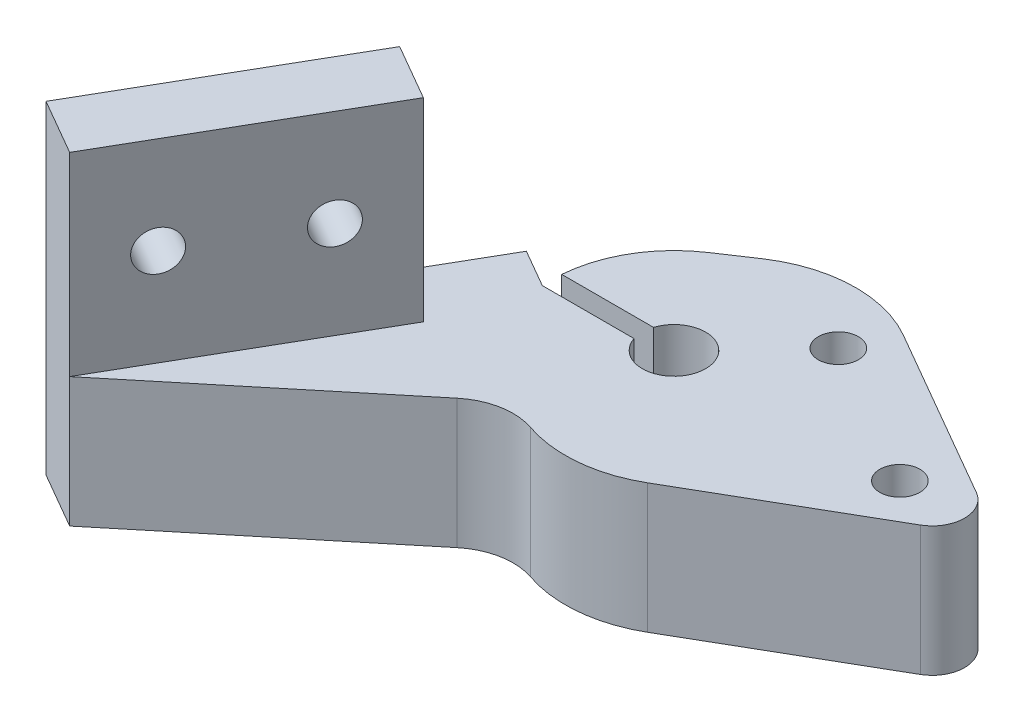
ISO-10303-21;
HEADER;
FILE_DESCRIPTION(('STEP AP214'),'2;1');
FILE_NAME('part.step','',(''),(''),'','','');
FILE_SCHEMA(('AUTOMOTIVE_DESIGN { 1 0 10303 214 1 1 1 1 }'));
ENDSEC;
DATA;
#1=APPLICATION_CONTEXT('core data for automotive mechanical design processes');
#2=APPLICATION_PROTOCOL_DEFINITION('international standard','automotive_design',2000,#1);
#3=PRODUCT_CONTEXT('',#1,'mechanical');
#4=PRODUCT('Part','Part','',(#3));
#5=PRODUCT_RELATED_PRODUCT_CATEGORY('part','',(#4));
#6=PRODUCT_DEFINITION_FORMATION('','',#4);
#7=PRODUCT_DEFINITION_CONTEXT('part definition',#1,'design');
#8=PRODUCT_DEFINITION('design','',#6,#7);
#9=PRODUCT_DEFINITION_SHAPE('','',#8);
#10=(LENGTH_UNIT() NAMED_UNIT(*) SI_UNIT(.MILLI.,.METRE.));
#11=(NAMED_UNIT(*) PLANE_ANGLE_UNIT() SI_UNIT($,.RADIAN.));
#12=(NAMED_UNIT(*) SI_UNIT($,.STERADIAN.) SOLID_ANGLE_UNIT());
#13=UNCERTAINTY_MEASURE_WITH_UNIT(LENGTH_MEASURE(1.E-05),#10,'distance_accuracy_value','');
#14=(GEOMETRIC_REPRESENTATION_CONTEXT(3) GLOBAL_UNCERTAINTY_ASSIGNED_CONTEXT((#13)) GLOBAL_UNIT_ASSIGNED_CONTEXT((#10,
#11,#12)) REPRESENTATION_CONTEXT('',''));
#15=CARTESIAN_POINT('',(0.,0.,0.));
#16=DIRECTION('',(0.,0.,1.));
#17=DIRECTION('',(1.,0.,0.));
#18=AXIS2_PLACEMENT_3D('',#15,#16,#17);
#19=CARTESIAN_POINT('',(-9.95,10.,0.));
#20=DIRECTION('',(0.,-1.,0.));
#21=DIRECTION('',(0.,0.,-1.));
#22=AXIS2_PLACEMENT_3D('',#19,#20,#21);
#23=CYLINDRICAL_SURFACE('',#22,9.45);
#24=CARTESIAN_POINT('',(-9.95,0.,0.));
#25=DIRECTION('',(0.,1.,0.));
#26=DIRECTION('',(0.,0.,1.));
#27=AXIS2_PLACEMENT_3D('',#24,#25,#26);
#28=CIRCLE('',#27,9.45);
#29=CARTESIAN_POINT('',(-15.1916063033956,0.,-7.86308230658969));
#30=VERTEX_POINT('',#29);
#31=CARTESIAN_POINT('',(-19.3701910808646,0.,-0.749999999999998));
#32=VERTEX_POINT('',#31);
#33=EDGE_CURVE('E285',#30,#32,#28,.T.);
#34=ORIENTED_EDGE('',*,*,#33,.T.);
#35=DIRECTION('',(0.,-1.,0.));
#36=VECTOR('',#35,1.);
#37=CARTESIAN_POINT('',(-19.3701910808646,10.,-0.749999999999998));
#38=LINE('',#37,#36);
#39=CARTESIAN_POINT('',(-19.3701910808646,10.,-0.749999999999998));
#40=VERTEX_POINT('',#39);
#41=EDGE_CURVE('E330',#32,#40,#38,.F.);
#42=ORIENTED_EDGE('',*,*,#41,.T.);
#43=CARTESIAN_POINT('',(-9.95,10.,0.));
#44=DIRECTION('',(0.,1.,0.));
#45=DIRECTION('',(0.,0.,1.));
#46=AXIS2_PLACEMENT_3D('',#43,#44,#45);
#47=CIRCLE('',#46,9.45);
#48=CARTESIAN_POINT('',(-15.1916063033956,10.,-7.86308230658969));
#49=VERTEX_POINT('',#48);
#50=EDGE_CURVE('E284',#49,#40,#47,.T.);
#51=ORIENTED_EDGE('',*,*,#50,.F.);
#52=DIRECTION('',(0.,-1.,0.));
#53=VECTOR('',#52,1.);
#54=CARTESIAN_POINT('',(-15.1916063033956,10.,-7.86308230658969));
#55=LINE('',#54,#53);
#56=EDGE_CURVE('E281',#49,#30,#55,.T.);
#57=ORIENTED_EDGE('',*,*,#56,.T.);
#58=EDGE_LOOP('',(#34,#42,#51,#57));
#59=FACE_BOUND('',#58,.T.);
#60=ADVANCED_FACE('F35',(#59),#23,.T.);
#61=CARTESIAN_POINT('',(-7.12122377100341,10.,1.22468911520026));
#62=DIRECTION('',(0.,1.,0.));
#63=DIRECTION('',(0.,0.,1.));
#64=AXIS2_PLACEMENT_3D('',#61,#62,#63);
#65=PLANE('',#64);
#66=DIRECTION('',(-0.866025403784438,0.,-0.500000000000001));
#67=VECTOR('',#66,1.);
#68=CARTESIAN_POINT('',(-25.8686831430116,10.,5.27196790422171));
#69=LINE('',#68,#67);
#70=CARTESIAN_POINT('',(-21.5385561240894,10.,7.77196790422172));
#71=VERTEX_POINT('',#70);
#72=CARTESIAN_POINT('',(-25.8686831430116,10.,5.27196790422171));
#73=VERTEX_POINT('',#72);
#74=EDGE_CURVE('E176',#71,#73,#69,.T.);
#75=ORIENTED_EDGE('',*,*,#74,.F.);
#76=DIRECTION('',(0.500000000000001,0.,-0.866025403784438));
#77=VECTOR('',#76,1.);
#78=CARTESIAN_POINT('',(-31.5385561240894,10.,25.0924759799105));
#79=LINE('',#78,#77);
#80=CARTESIAN_POINT('',(-31.5385561240894,10.,25.0924759799105));
#81=VERTEX_POINT('',#80);
#82=EDGE_CURVE('E214',#81,#71,#79,.T.);
#83=ORIENTED_EDGE('',*,*,#82,.F.);
#84=DIRECTION('',(0.771799318585592,0.,-0.635866190193201));
#85=VECTOR('',#84,1.);
#86=CARTESIAN_POINT('',(-0.437441388363334,10.,-0.530955994621095));
#87=LINE('',#86,#85);
#88=CARTESIAN_POINT('',(-15.1240706779427,10.,11.5689912173808));
#89=VERTEX_POINT('',#88);
#90=EDGE_CURVE('E200',#81,#89,#87,.T.);
#91=ORIENTED_EDGE('',*,*,#90,.T.);
#92=CARTESIAN_POINT('',(-11.9447397269767,10.,15.4279878103088));
#93=DIRECTION('',(0.,1.,0.));
#94=DIRECTION('',(0.,0.,1.));
#95=AXIS2_PLACEMENT_3D('',#92,#93,#94);
#96=CIRCLE('',#95,5.);
#97=CARTESIAN_POINT('',(-10.3369010749856,10.,10.6935549119393));
#98=VERTEX_POINT('',#97);
#99=EDGE_CURVE('E11',#89,#98,#96,.F.);
#100=ORIENTED_EDGE('',*,*,#99,.T.);
#101=CARTESIAN_POINT('',(-7.12122377100341,10.,1.22468911520026));
#102=DIRECTION('',(0.,1.,0.));
#103=DIRECTION('',(0.,0.,1.));
#104=AXIS2_PLACEMENT_3D('',#101,#102,#103);
#105=CIRCLE('',#104,10.);
#106=CARTESIAN_POINT('',(-2.12122377100337,10.,9.88494315304462));
#107=VERTEX_POINT('',#106);
#108=EDGE_CURVE('E288',#98,#107,#105,.T.);
#109=ORIENTED_EDGE('',*,*,#108,.T.);
#110=DIRECTION('',(0.866025403784439,0.,-0.5));
#111=VECTOR('',#110,1.);
#112=CARTESIAN_POINT('',(-2.12122377100337,10.,9.88494315304462));
#113=LINE('',#112,#111);
#114=CARTESIAN_POINT('',(11.25,10.,2.16506350946111));
#115=VERTEX_POINT('',#114);
#116=EDGE_CURVE('E312',#107,#115,#113,.T.);
#117=ORIENTED_EDGE('',*,*,#116,.T.);
#118=CARTESIAN_POINT('',(10.,10.,0.));
#119=DIRECTION('',(0.,1.,0.));
#120=DIRECTION('',(0.,0.,-1.));
#121=AXIS2_PLACEMENT_3D('',#118,#119,#120);
#122=CIRCLE('',#121,2.5);
#123=CARTESIAN_POINT('',(11.25,10.,-2.16506350946111));
#124=VERTEX_POINT('',#123);
#125=EDGE_CURVE('E310',#115,#124,#122,.T.);
#126=ORIENTED_EDGE('',*,*,#125,.T.);
#127=DIRECTION('',(-0.866025403784439,0.,-0.5));
#128=VECTOR('',#127,1.);
#129=CARTESIAN_POINT('',(11.25,10.,-2.16506350946111));
#130=LINE('',#129,#128);
#131=CARTESIAN_POINT('',(-2.12122377100337,10.,-9.88494315304462));
#132=VERTEX_POINT('',#131);
#133=EDGE_CURVE('E308',#124,#132,#130,.T.);
#134=ORIENTED_EDGE('',*,*,#133,.T.);
#135=CARTESIAN_POINT('',(-7.12122377100341,10.,-1.22468911520026));
#136=DIRECTION('',(0.,1.,0.));
#137=DIRECTION('',(0.,0.,1.));
#138=AXIS2_PLACEMENT_3D('',#135,#136,#137);
#139=CIRCLE('',#138,10.);
#140=CARTESIAN_POINT('',(-12.66789710793,10.,-9.54541113275546));
#141=VERTEX_POINT('',#140);
#142=EDGE_CURVE('E306',#132,#141,#139,.T.);
#143=ORIENTED_EDGE('',*,*,#142,.T.);
#144=DIRECTION('',(-0.832072201755523,0.,0.554667333692653));
#145=VECTOR('',#144,1.);
#146=CARTESIAN_POINT('',(-12.66789710793,10.,-9.54541113275546));
#147=LINE('',#146,#145);
#148=EDGE_CURVE('E304',#141,#49,#147,.T.);
#149=ORIENTED_EDGE('',*,*,#148,.T.);
#150=ORIENTED_EDGE('',*,*,#50,.T.);
#151=DIRECTION('',(-1.,0.,0.));
#152=VECTOR('',#151,1.);
#153=CARTESIAN_POINT('',(-9.95,10.,-0.750000000000002));
#154=LINE('',#153,#152);
#155=CARTESIAN_POINT('',(-12.2823807579381,10.,-0.750000000000001));
#156=VERTEX_POINT('',#155);
#157=EDGE_CURVE('E202',#156,#40,#154,.T.);
#158=ORIENTED_EDGE('',*,*,#157,.F.);
#159=CARTESIAN_POINT('',(-9.95,10.,0.));
#160=DIRECTION('',(0.,1.,0.));
#161=DIRECTION('',(0.,0.,1.));
#162=AXIS2_PLACEMENT_3D('',#159,#160,#161);
#163=CIRCLE('',#162,2.45);
#164=CARTESIAN_POINT('',(-12.2823807579381,10.,0.749999999999998));
#165=VERTEX_POINT('',#164);
#166=EDGE_CURVE('E324',#165,#156,#163,.T.);
#167=ORIENTED_EDGE('',*,*,#166,.F.);
#168=DIRECTION('',(1.,0.,0.));
#169=VECTOR('',#168,1.);
#170=CARTESIAN_POINT('',(-9.95,10.,0.749999999999998));
#171=LINE('',#170,#169);
#172=CARTESIAN_POINT('',(-19.3701910808646,10.,0.75));
#173=VERTEX_POINT('',#172);
#174=EDGE_CURVE('E339',#173,#165,#171,.T.);
#175=ORIENTED_EDGE('',*,*,#174,.F.);
#176=DIRECTION('',(-0.866025403784439,0.,-0.5));
#177=VECTOR('',#176,1.);
#178=CARTESIAN_POINT('',(-5.1673072966353,10.,8.95003877609373));
#179=LINE('',#178,#177);
#180=CARTESIAN_POINT('',(-22.2859905873979,10.,-0.933437629999999));
#181=VERTEX_POINT('',#180);
#182=EDGE_CURVE('E198',#173,#181,#179,.T.);
#183=ORIENTED_EDGE('',*,*,#182,.T.);
#184=DIRECTION('',(-0.500000000000001,0.,0.866025403784438));
#185=VECTOR('',#184,1.);
#186=CARTESIAN_POINT('',(-17.1186832907626,10.,-9.88347640609373));
#187=LINE('',#186,#185);
#188=EDGE_CURVE('E203',#181,#73,#187,.T.);
#189=ORIENTED_EDGE('',*,*,#188,.T.);
#190=EDGE_LOOP('',(#75,#83,#91,#100,#109,#117,#126,#134,#143,#149,#150,#158,#167,#175,#183,#189));
#191=FACE_BOUND('',#190,.T.);
#192=CARTESIAN_POINT('',(-3.75,10.,-6.49519052838329));
#193=DIRECTION('',(0.,1.,0.));
#194=DIRECTION('',(0.,0.,1.));
#195=AXIS2_PLACEMENT_3D('',#192,#193,#194);
#196=CIRCLE('',#195,1.55);
#197=CARTESIAN_POINT('',(-3.75,10.,-4.94519052838329));
#198=VERTEX_POINT('',#197);
#199=EDGE_CURVE('E318',#198,#198,#196,.T.);
#200=ORIENTED_EDGE('',*,*,#199,.F.);
#201=EDGE_LOOP('',(#200));
#202=FACE_BOUND('',#201,.T.);
#203=CARTESIAN_POINT('',(7.5,10.,0.));
#204=DIRECTION('',(0.,1.,0.));
#205=DIRECTION('',(0.,0.,1.));
#206=AXIS2_PLACEMENT_3D('',#203,#204,#205);
#207=CIRCLE('',#206,1.55);
#208=CARTESIAN_POINT('',(7.5,10.,1.55));
#209=VERTEX_POINT('',#208);
#210=EDGE_CURVE('E301',#209,#209,#207,.T.);
#211=ORIENTED_EDGE('',*,*,#210,.F.);
#212=EDGE_LOOP('',(#211));
#213=FACE_BOUND('',#212,.T.);
#214=ADVANCED_FACE('F364',(#191,#202,#213),#65,.T.);
#215=CARTESIAN_POINT('',(-7.12122377100341,0.,1.22468911520026));
#216=DIRECTION('',(0.,1.,0.));
#217=DIRECTION('',(0.,0.,1.));
#218=AXIS2_PLACEMENT_3D('',#215,#216,#217);
#219=PLANE('',#218);
#220=CARTESIAN_POINT('',(-3.75,0.,-6.49519052838329));
#221=DIRECTION('',(0.,1.,0.));
#222=DIRECTION('',(0.,0.,1.));
#223=AXIS2_PLACEMENT_3D('',#220,#221,#222);
#224=CIRCLE('',#223,1.55);
#225=CARTESIAN_POINT('',(-3.75,0.,-4.94519052838329));
#226=VERTEX_POINT('',#225);
#227=EDGE_CURVE('E321',#226,#226,#224,.T.);
#228=ORIENTED_EDGE('',*,*,#227,.T.);
#229=EDGE_LOOP('',(#228));
#230=FACE_BOUND('',#229,.T.);
#231=CARTESIAN_POINT('',(-9.95,0.,0.));
#232=DIRECTION('',(0.,1.,0.));
#233=DIRECTION('',(0.,0.,1.));
#234=AXIS2_PLACEMENT_3D('',#231,#232,#233);
#235=CIRCLE('',#234,2.45);
#236=CARTESIAN_POINT('',(-12.2823807579381,0.,0.749999999999999));
#237=VERTEX_POINT('',#236);
#238=CARTESIAN_POINT('',(-12.2823807579381,0.,-0.750000000000001));
#239=VERTEX_POINT('',#238);
#240=EDGE_CURVE('E327',#237,#239,#235,.T.);
#241=ORIENTED_EDGE('',*,*,#240,.T.);
#242=DIRECTION('',(-1.,0.,0.));
#243=VECTOR('',#242,1.);
#244=CARTESIAN_POINT('',(-9.95,0.,-0.750000000000002));
#245=LINE('',#244,#243);
#246=EDGE_CURVE('E341',#239,#32,#245,.T.);
#247=ORIENTED_EDGE('',*,*,#246,.T.);
#248=ORIENTED_EDGE('',*,*,#33,.F.);
#249=DIRECTION('',(-0.832072201755523,0.,0.554667333692653));
#250=VECTOR('',#249,1.);
#251=CARTESIAN_POINT('',(-12.66789710793,0.,-9.54541113275546));
#252=LINE('',#251,#250);
#253=CARTESIAN_POINT('',(-12.66789710793,0.,-9.54541113275546));
#254=VERTEX_POINT('',#253);
#255=EDGE_CURVE('E289',#254,#30,#252,.T.);
#256=ORIENTED_EDGE('',*,*,#255,.F.);
#257=CARTESIAN_POINT('',(-7.12122377100341,0.,-1.22468911520026));
#258=DIRECTION('',(0.,1.,0.));
#259=DIRECTION('',(0.,0.,1.));
#260=AXIS2_PLACEMENT_3D('',#257,#258,#259);
#261=CIRCLE('',#260,10.);
#262=CARTESIAN_POINT('',(-2.12122377100337,0.,-9.88494315304462));
#263=VERTEX_POINT('',#262);
#264=EDGE_CURVE('E291',#263,#254,#261,.T.);
#265=ORIENTED_EDGE('',*,*,#264,.F.);
#266=DIRECTION('',(-0.866025403784439,0.,-0.5));
#267=VECTOR('',#266,1.);
#268=CARTESIAN_POINT('',(11.25,0.,-2.16506350946111));
#269=LINE('',#268,#267);
#270=CARTESIAN_POINT('',(11.25,0.,-2.16506350946111));
#271=VERTEX_POINT('',#270);
#272=EDGE_CURVE('E293',#271,#263,#269,.T.);
#273=ORIENTED_EDGE('',*,*,#272,.F.);
#274=CARTESIAN_POINT('',(10.,0.,0.));
#275=DIRECTION('',(0.,1.,0.));
#276=DIRECTION('',(0.,0.,-1.));
#277=AXIS2_PLACEMENT_3D('',#274,#275,#276);
#278=CIRCLE('',#277,2.5);
#279=CARTESIAN_POINT('',(11.25,0.,2.16506350946111));
#280=VERTEX_POINT('',#279);
#281=EDGE_CURVE('E295',#280,#271,#278,.T.);
#282=ORIENTED_EDGE('',*,*,#281,.F.);
#283=DIRECTION('',(0.866025403784439,0.,-0.5));
#284=VECTOR('',#283,1.);
#285=CARTESIAN_POINT('',(-2.12122377100337,0.,9.88494315304462));
#286=LINE('',#285,#284);
#287=CARTESIAN_POINT('',(-2.12122377100337,0.,9.88494315304462));
#288=VERTEX_POINT('',#287);
#289=EDGE_CURVE('E297',#288,#280,#286,.T.);
#290=ORIENTED_EDGE('',*,*,#289,.F.);
#291=CARTESIAN_POINT('',(-7.12122377100341,0.,1.22468911520026));
#292=DIRECTION('',(0.,1.,0.));
#293=DIRECTION('',(0.,0.,1.));
#294=AXIS2_PLACEMENT_3D('',#291,#292,#293);
#295=CIRCLE('',#294,10.);
#296=CARTESIAN_POINT('',(-10.3369010749856,0.,10.6935549119393));
#297=VERTEX_POINT('',#296);
#298=EDGE_CURVE('E299',#297,#288,#295,.T.);
#299=ORIENTED_EDGE('',*,*,#298,.F.);
#300=CARTESIAN_POINT('',(-11.9447397269767,0.,15.4279878103088));
#301=DIRECTION('',(0.,1.,0.));
#302=DIRECTION('',(0.,0.,1.));
#303=AXIS2_PLACEMENT_3D('',#300,#301,#302);
#304=CIRCLE('',#303,5.);
#305=CARTESIAN_POINT('',(-15.1240706779427,0.,11.5689912173808));
#306=VERTEX_POINT('',#305);
#307=EDGE_CURVE('E43',#297,#306,#304,.T.);
#308=ORIENTED_EDGE('',*,*,#307,.T.);
#309=DIRECTION('',(0.771799318585592,0.,-0.635866190193201));
#310=VECTOR('',#309,1.);
#311=CARTESIAN_POINT('',(-0.437441388363334,0.,-0.530955994621095));
#312=LINE('',#311,#310);
#313=CARTESIAN_POINT('',(-31.5385561240894,0.,25.0924759799105));
#314=VERTEX_POINT('',#313);
#315=EDGE_CURVE('E197',#314,#306,#312,.T.);
#316=ORIENTED_EDGE('',*,*,#315,.F.);
#317=DIRECTION('',(0.866025403784439,0.,0.5));
#318=VECTOR('',#317,1.);
#319=CARTESIAN_POINT('',(-18.749999852249,0.,32.4759523860042));
#320=LINE('',#319,#318);
#321=CARTESIAN_POINT('',(-35.8686831430116,0.,22.5924759799105));
#322=VERTEX_POINT('',#321);
#323=EDGE_CURVE('E195',#322,#314,#320,.T.);
#324=ORIENTED_EDGE('',*,*,#323,.F.);
#325=DIRECTION('',(-0.500000000000001,0.,0.866025403784438));
#326=VECTOR('',#325,1.);
#327=CARTESIAN_POINT('',(-17.1186832907626,0.,-9.88347640609373));
#328=LINE('',#327,#326);
#329=CARTESIAN_POINT('',(-22.2859905873979,0.,-0.933437629999999));
#330=VERTEX_POINT('',#329);
#331=EDGE_CURVE('E191',#330,#322,#328,.T.);
#332=ORIENTED_EDGE('',*,*,#331,.F.);
#333=DIRECTION('',(-0.866025403784439,0.,-0.5));
#334=VECTOR('',#333,1.);
#335=CARTESIAN_POINT('',(-5.1673072966353,0.,8.95003877609373));
#336=LINE('',#335,#334);
#337=CARTESIAN_POINT('',(-19.3701910808646,0.,0.75));
#338=VERTEX_POINT('',#337);
#339=EDGE_CURVE('E182',#338,#330,#336,.T.);
#340=ORIENTED_EDGE('',*,*,#339,.F.);
#341=DIRECTION('',(1.,0.,0.));
#342=VECTOR('',#341,1.);
#343=CARTESIAN_POINT('',(-9.95,0.,0.749999999999998));
#344=LINE('',#343,#342);
#345=EDGE_CURVE('E338',#338,#237,#344,.T.);
#346=ORIENTED_EDGE('',*,*,#345,.T.);
#347=EDGE_LOOP('',(#241,#247,#248,#256,#265,#273,#282,#290,#299,#308,#316,#324,#332,#340,#346));
#348=FACE_BOUND('',#347,.T.);
#349=CARTESIAN_POINT('',(7.5,0.,0.));
#350=DIRECTION('',(0.,1.,0.));
#351=DIRECTION('',(0.,0.,1.));
#352=AXIS2_PLACEMENT_3D('',#349,#350,#351);
#353=CIRCLE('',#352,1.55);
#354=CARTESIAN_POINT('',(7.5,0.,1.55));
#355=VERTEX_POINT('',#354);
#356=EDGE_CURVE('E315',#355,#355,#353,.T.);
#357=ORIENTED_EDGE('',*,*,#356,.T.);
#358=EDGE_LOOP('',(#357));
#359=FACE_BOUND('',#358,.T.);
#360=ADVANCED_FACE('F357',(#230,#348,#359),#219,.F.);
#361=CARTESIAN_POINT('',(-7.12122377100341,10.,1.22468911520026));
#362=DIRECTION('',(0.,-1.,0.));
#363=DIRECTION('',(0.,0.,-1.));
#364=AXIS2_PLACEMENT_3D('',#361,#362,#363);
#365=CYLINDRICAL_SURFACE('',#364,10.);
#366=ORIENTED_EDGE('',*,*,#108,.F.);
#367=DIRECTION('',(0.,-1.,0.));
#368=VECTOR('',#367,1.);
#369=CARTESIAN_POINT('',(-10.3369010749856,10.,10.6935549119393));
#370=LINE('',#369,#368);
#371=EDGE_CURVE('E252',#98,#297,#370,.T.);
#372=ORIENTED_EDGE('',*,*,#371,.T.);
#373=ORIENTED_EDGE('',*,*,#298,.T.);
#374=DIRECTION('',(0.,-1.,0.));
#375=VECTOR('',#374,1.);
#376=CARTESIAN_POINT('',(-2.12122377100337,10.,9.88494315304462));
#377=LINE('',#376,#375);
#378=EDGE_CURVE('E262',#107,#288,#377,.T.);
#379=ORIENTED_EDGE('',*,*,#378,.F.);
#380=EDGE_LOOP('',(#366,#372,#373,#379));
#381=FACE_BOUND('',#380,.T.);
#382=ADVANCED_FACE('F398',(#381),#365,.T.);
#383=CARTESIAN_POINT('',(-2.12122377100337,10.,9.88494315304462));
#384=DIRECTION('',(-0.5,0.,-0.866025403784439));
#385=DIRECTION('',(-0.866025403784439,0.,0.5));
#386=AXIS2_PLACEMENT_3D('',#383,#384,#385);
#387=PLANE('',#386);
#388=ORIENTED_EDGE('',*,*,#289,.T.);
#389=DIRECTION('',(0.,-1.,0.));
#390=VECTOR('',#389,1.);
#391=CARTESIAN_POINT('',(11.25,10.,2.16506350946111));
#392=LINE('',#391,#390);
#393=EDGE_CURVE('E267',#115,#280,#392,.T.);
#394=ORIENTED_EDGE('',*,*,#393,.F.);
#395=ORIENTED_EDGE('',*,*,#116,.F.);
#396=ORIENTED_EDGE('',*,*,#378,.T.);
#397=EDGE_LOOP('',(#388,#394,#395,#396));
#398=FACE_BOUND('',#397,.T.);
#399=ADVANCED_FACE('F397',(#398),#387,.F.);
#400=CARTESIAN_POINT('',(10.,10.,0.));
#401=DIRECTION('',(0.,-1.,0.));
#402=DIRECTION('',(0.,0.,-1.));
#403=AXIS2_PLACEMENT_3D('',#400,#401,#402);
#404=CYLINDRICAL_SURFACE('',#403,2.5);
#405=ORIENTED_EDGE('',*,*,#281,.T.);
#406=DIRECTION('',(0.,-1.,0.));
#407=VECTOR('',#406,1.);
#408=CARTESIAN_POINT('',(11.25,10.,-2.16506350946111));
#409=LINE('',#408,#407);
#410=EDGE_CURVE('E272',#124,#271,#409,.T.);
#411=ORIENTED_EDGE('',*,*,#410,.F.);
#412=ORIENTED_EDGE('',*,*,#125,.F.);
#413=ORIENTED_EDGE('',*,*,#393,.T.);
#414=EDGE_LOOP('',(#405,#411,#412,#413));
#415=FACE_BOUND('',#414,.T.);
#416=ADVANCED_FACE('F391',(#415),#404,.T.);
#417=CARTESIAN_POINT('',(11.25,10.,-2.16506350946111));
#418=DIRECTION('',(-0.5,0.,0.866025403784439));
#419=DIRECTION('',(0.866025403784439,0.,0.5));
#420=AXIS2_PLACEMENT_3D('',#417,#418,#419);
#421=PLANE('',#420);
#422=ORIENTED_EDGE('',*,*,#272,.T.);
#423=DIRECTION('',(0.,-1.,0.));
#424=VECTOR('',#423,1.);
#425=CARTESIAN_POINT('',(-2.12122377100337,10.,-9.88494315304462));
#426=LINE('',#425,#424);
#427=EDGE_CURVE('E275',#132,#263,#426,.T.);
#428=ORIENTED_EDGE('',*,*,#427,.F.);
#429=ORIENTED_EDGE('',*,*,#133,.F.);
#430=ORIENTED_EDGE('',*,*,#410,.T.);
#431=EDGE_LOOP('',(#422,#428,#429,#430));
#432=FACE_BOUND('',#431,.T.);
#433=ADVANCED_FACE('F387',(#432),#421,.F.);
#434=CARTESIAN_POINT('',(-7.12122377100341,10.,-1.22468911520026));
#435=DIRECTION('',(0.,-1.,0.));
#436=DIRECTION('',(0.,0.,-1.));
#437=AXIS2_PLACEMENT_3D('',#434,#435,#436);
#438=CYLINDRICAL_SURFACE('',#437,10.);
#439=ORIENTED_EDGE('',*,*,#264,.T.);
#440=DIRECTION('',(0.,-1.,0.));
#441=VECTOR('',#440,1.);
#442=CARTESIAN_POINT('',(-12.66789710793,10.,-9.54541113275546));
#443=LINE('',#442,#441);
#444=EDGE_CURVE('E278',#141,#254,#443,.T.);
#445=ORIENTED_EDGE('',*,*,#444,.F.);
#446=ORIENTED_EDGE('',*,*,#142,.F.);
#447=ORIENTED_EDGE('',*,*,#427,.T.);
#448=EDGE_LOOP('',(#439,#445,#446,#447));
#449=FACE_BOUND('',#448,.T.);
#450=ADVANCED_FACE('F382',(#449),#438,.T.);
#451=CARTESIAN_POINT('',(-12.66789710793,10.,-9.54541113275546));
#452=DIRECTION('',(0.554667333692653,0.,0.832072201755523));
#453=DIRECTION('',(0.832072201755523,0.,-0.554667333692653));
#454=AXIS2_PLACEMENT_3D('',#451,#452,#453);
#455=PLANE('',#454);
#456=ORIENTED_EDGE('',*,*,#255,.T.);
#457=ORIENTED_EDGE('',*,*,#56,.F.);
#458=ORIENTED_EDGE('',*,*,#148,.F.);
#459=ORIENTED_EDGE('',*,*,#444,.T.);
#460=EDGE_LOOP('',(#456,#457,#458,#459));
#461=FACE_BOUND('',#460,.T.);
#462=ADVANCED_FACE('F376',(#461),#455,.F.);
#463=CARTESIAN_POINT('',(7.5,10.,0.));
#464=DIRECTION('',(0.,-1.,0.));
#465=DIRECTION('',(0.,0.,-1.));
#466=AXIS2_PLACEMENT_3D('',#463,#464,#465);
#467=CYLINDRICAL_SURFACE('',#466,1.55);
#468=ORIENTED_EDGE('',*,*,#210,.T.);
#469=EDGE_LOOP('',(#468));
#470=FACE_BOUND('',#469,.T.);
#471=ORIENTED_EDGE('',*,*,#356,.F.);
#472=EDGE_LOOP('',(#471));
#473=FACE_BOUND('',#472,.T.);
#474=ADVANCED_FACE('F419',(#470,#473),#467,.F.);
#475=CARTESIAN_POINT('',(-3.75,10.,-6.49519052838329));
#476=DIRECTION('',(0.,-1.,0.));
#477=DIRECTION('',(0.,0.,-1.));
#478=AXIS2_PLACEMENT_3D('',#475,#476,#477);
#479=CYLINDRICAL_SURFACE('',#478,1.55);
#480=ORIENTED_EDGE('',*,*,#199,.T.);
#481=EDGE_LOOP('',(#480));
#482=FACE_BOUND('',#481,.T.);
#483=ORIENTED_EDGE('',*,*,#227,.F.);
#484=EDGE_LOOP('',(#483));
#485=FACE_BOUND('',#484,.T.);
#486=ADVANCED_FACE('F436',(#482,#485),#479,.F.);
#487=CARTESIAN_POINT('',(-9.95,10.,0.));
#488=DIRECTION('',(0.,-1.,0.));
#489=DIRECTION('',(0.,0.,-1.));
#490=AXIS2_PLACEMENT_3D('',#487,#488,#489);
#491=CYLINDRICAL_SURFACE('',#490,2.45);
#492=DIRECTION('',(0.,-1.,0.));
#493=VECTOR('',#492,1.);
#494=CARTESIAN_POINT('',(-12.2823807579381,10.,-0.750000000000001));
#495=LINE('',#494,#493);
#496=EDGE_CURVE('E210',#239,#156,#495,.F.);
#497=ORIENTED_EDGE('',*,*,#496,.F.);
#498=ORIENTED_EDGE('',*,*,#240,.F.);
#499=DIRECTION('',(0.,-1.,0.));
#500=VECTOR('',#499,1.);
#501=CARTESIAN_POINT('',(-12.2823807579381,10.,0.749999999999999));
#502=LINE('',#501,#500);
#503=EDGE_CURVE('E258',#165,#237,#502,.T.);
#504=ORIENTED_EDGE('',*,*,#503,.F.);
#505=ORIENTED_EDGE('',*,*,#166,.T.);
#506=EDGE_LOOP('',(#497,#498,#504,#505));
#507=FACE_BOUND('',#506,.T.);
#508=ADVANCED_FACE('F367',(#507),#491,.F.);
#509=CARTESIAN_POINT('',(-9.95,0.,0.749999999999998));
#510=DIRECTION('',(0.,0.,1.));
#511=DIRECTION('',(1.,0.,0.));
#512=AXIS2_PLACEMENT_3D('',#509,#510,#511);
#513=PLANE('',#512);
#514=ORIENTED_EDGE('',*,*,#174,.T.);
#515=ORIENTED_EDGE('',*,*,#503,.T.);
#516=ORIENTED_EDGE('',*,*,#345,.F.);
#517=DIRECTION('',(0.,-1.,0.));
#518=VECTOR('',#517,1.);
#519=CARTESIAN_POINT('',(-19.3701910808646,10.,0.75));
#520=LINE('',#519,#518);
#521=EDGE_CURVE('E335',#173,#338,#520,.T.);
#522=ORIENTED_EDGE('',*,*,#521,.F.);
#523=EDGE_LOOP('',(#514,#515,#516,#522));
#524=FACE_BOUND('',#523,.T.);
#525=ADVANCED_FACE('F361',(#524),#513,.F.);
#526=CARTESIAN_POINT('',(-9.95,0.,-0.750000000000002));
#527=DIRECTION('',(0.,0.,-1.));
#528=DIRECTION('',(-1.,0.,0.));
#529=AXIS2_PLACEMENT_3D('',#526,#527,#528);
#530=PLANE('',#529);
#531=ORIENTED_EDGE('',*,*,#246,.F.);
#532=ORIENTED_EDGE('',*,*,#496,.T.);
#533=ORIENTED_EDGE('',*,*,#157,.T.);
#534=ORIENTED_EDGE('',*,*,#41,.F.);
#535=EDGE_LOOP('',(#531,#532,#533,#534));
#536=FACE_BOUND('',#535,.T.);
#537=ADVANCED_FACE('F448',(#536),#530,.F.);
#538=CARTESIAN_POINT('',(-5.1673072966353,44.8658092101153,8.95003877609373));
#539=DIRECTION('',(-0.5,0.,0.866025403784439));
#540=DIRECTION('',(0.866025403784439,0.,0.5));
#541=AXIS2_PLACEMENT_3D('',#538,#539,#540);
#542=PLANE('',#541);
#543=ORIENTED_EDGE('',*,*,#182,.F.);
#544=ORIENTED_EDGE('',*,*,#521,.T.);
#545=ORIENTED_EDGE('',*,*,#339,.T.);
#546=DIRECTION('',(0.,-1.,0.));
#547=VECTOR('',#546,1.);
#548=CARTESIAN_POINT('',(-22.2859905873979,44.8658092101153,-0.933437629999999));
#549=LINE('',#548,#547);
#550=EDGE_CURVE('E185',#181,#330,#549,.T.);
#551=ORIENTED_EDGE('',*,*,#550,.F.);
#552=EDGE_LOOP('',(#543,#544,#545,#551));
#553=FACE_BOUND('',#552,.T.);
#554=ADVANCED_FACE('F359',(#553),#542,.F.);
#555=CARTESIAN_POINT('',(-17.1186832907626,44.8658092101153,-9.88347640609373));
#556=DIRECTION('',(0.866025403784438,0.,0.500000000000001));
#557=DIRECTION('',(0.500000000000001,0.,-0.866025403784438));
#558=AXIS2_PLACEMENT_3D('',#555,#556,#557);
#559=PLANE('',#558);
#560=CARTESIAN_POINT('',(-33.3686831430116,17.5,18.2623489609883));
#561=DIRECTION('',(0.866025403784438,0.,0.500000000000001));
#562=DIRECTION('',(0.500000000000001,0.,-0.866025403784438));
#563=AXIS2_PLACEMENT_3D('',#560,#561,#562);
#564=CIRCLE('',#563,1.55399999999999);
#565=CARTESIAN_POINT('',(-32.5916831430116,17.5,16.9165454835073));
#566=VERTEX_POINT('',#565);
#567=EDGE_CURVE('E225',#566,#566,#564,.T.);
#568=ORIENTED_EDGE('',*,*,#567,.T.);
#569=EDGE_LOOP('',(#568));
#570=FACE_BOUND('',#569,.T.);
#571=CARTESIAN_POINT('',(-28.3686831430116,17.5,9.6020949231439));
#572=DIRECTION('',(0.866025403784438,0.,0.500000000000001));
#573=DIRECTION('',(0.500000000000001,0.,-0.866025403784438));
#574=AXIS2_PLACEMENT_3D('',#571,#572,#573);
#575=CIRCLE('',#574,1.55399999999999);
#576=CARTESIAN_POINT('',(-27.5916831430116,17.5,8.2562914456629));
#577=VERTEX_POINT('',#576);
#578=EDGE_CURVE('E219',#577,#577,#575,.T.);
#579=ORIENTED_EDGE('',*,*,#578,.T.);
#580=EDGE_LOOP('',(#579));
#581=FACE_BOUND('',#580,.T.);
#582=ORIENTED_EDGE('',*,*,#188,.F.);
#583=ORIENTED_EDGE('',*,*,#550,.T.);
#584=ORIENTED_EDGE('',*,*,#331,.T.);
#585=DIRECTION('',(0.,-1.,0.));
#586=VECTOR('',#585,1.);
#587=CARTESIAN_POINT('',(-35.8686831430116,44.8658092101153,22.5924759799105));
#588=LINE('',#587,#586);
#589=CARTESIAN_POINT('',(-35.8686831430116,25.,22.5924759799105));
#590=VERTEX_POINT('',#589);
#591=EDGE_CURVE('E194',#590,#322,#588,.T.);
#592=ORIENTED_EDGE('',*,*,#591,.F.);
#593=DIRECTION('',(-0.5,0.,0.866025403784438));
#594=VECTOR('',#593,1.);
#595=CARTESIAN_POINT('',(-35.8686831430116,25.,22.5924759799105));
#596=LINE('',#595,#594);
#597=CARTESIAN_POINT('',(-25.8686831430116,25.,5.27196790422171));
#598=VERTEX_POINT('',#597);
#599=EDGE_CURVE('E174',#598,#590,#596,.T.);
#600=ORIENTED_EDGE('',*,*,#599,.F.);
#601=DIRECTION('',(0.,-1.,0.));
#602=VECTOR('',#601,1.);
#603=CARTESIAN_POINT('',(-25.8686831430116,25.,5.27196790422171));
#604=LINE('',#603,#602);
#605=EDGE_CURVE('E187',#598,#73,#604,.T.);
#606=ORIENTED_EDGE('',*,*,#605,.T.);
#607=EDGE_LOOP('',(#582,#583,#584,#592,#600,#606));
#608=FACE_BOUND('',#607,.T.);
#609=ADVANCED_FACE('F350',(#570,#581,#608),#559,.F.);
#610=CARTESIAN_POINT('',(-18.749999852249,44.8658092101153,32.4759523860042));
#611=DIRECTION('',(0.5,0.,-0.866025403784439));
#612=DIRECTION('',(-0.866025403784439,0.,-0.5));
#613=AXIS2_PLACEMENT_3D('',#610,#611,#612);
#614=PLANE('',#613);
#615=DIRECTION('',(0.,-1.,0.));
#616=VECTOR('',#615,1.);
#617=CARTESIAN_POINT('',(-31.5385561240894,44.8658092101153,25.0924759799105));
#618=LINE('',#617,#616);
#619=EDGE_CURVE('E181',#81,#314,#618,.T.);
#620=ORIENTED_EDGE('',*,*,#619,.F.);
#621=DIRECTION('',(0.,-1.,0.));
#622=VECTOR('',#621,1.);
#623=CARTESIAN_POINT('',(-31.5385561240894,25.,25.0924759799105));
#624=LINE('',#623,#622);
#625=CARTESIAN_POINT('',(-31.5385561240894,25.,25.0924759799105));
#626=VERTEX_POINT('',#625);
#627=EDGE_CURVE('E162',#626,#81,#624,.T.);
#628=ORIENTED_EDGE('',*,*,#627,.F.);
#629=DIRECTION('',(0.866025403784438,0.,0.5));
#630=VECTOR('',#629,1.);
#631=CARTESIAN_POINT('',(-35.8686831430116,25.,22.5924759799105));
#632=LINE('',#631,#630);
#633=EDGE_CURVE('E168',#590,#626,#632,.T.);
#634=ORIENTED_EDGE('',*,*,#633,.F.);
#635=ORIENTED_EDGE('',*,*,#591,.T.);
#636=ORIENTED_EDGE('',*,*,#323,.T.);
#637=EDGE_LOOP('',(#620,#628,#634,#635,#636));
#638=FACE_BOUND('',#637,.T.);
#639=ADVANCED_FACE('F179',(#638),#614,.F.);
#640=CARTESIAN_POINT('',(-0.437441388363334,44.8658092101153,-0.530955994621095));
#641=DIRECTION('',(-0.635866190193201,0.,-0.771799318585592));
#642=DIRECTION('',(-0.771799318585592,0.,0.635866190193201));
#643=AXIS2_PLACEMENT_3D('',#640,#641,#642);
#644=PLANE('',#643);
#645=ORIENTED_EDGE('',*,*,#315,.T.);
#646=DIRECTION('',(0.,1.,0.));
#647=VECTOR('',#646,1.);
#648=CARTESIAN_POINT('',(-15.1240706779427,10.,11.5689912173808));
#649=LINE('',#648,#647);
#650=EDGE_CURVE('E56',#306,#89,#649,.T.);
#651=ORIENTED_EDGE('',*,*,#650,.T.);
#652=ORIENTED_EDGE('',*,*,#90,.F.);
#653=ORIENTED_EDGE('',*,*,#619,.T.);
#654=EDGE_LOOP('',(#645,#651,#652,#653));
#655=FACE_BOUND('',#654,.T.);
#656=ADVANCED_FACE('F238',(#655),#644,.F.);
#657=CARTESIAN_POINT('',(-31.5385561240894,25.,25.0924759799105));
#658=DIRECTION('',(-0.866025403784438,0.,-0.500000000000001));
#659=DIRECTION('',(-0.500000000000001,0.,0.866025403784438));
#660=AXIS2_PLACEMENT_3D('',#657,#658,#659);
#661=PLANE('',#660);
#662=CARTESIAN_POINT('',(-29.0385561240894,17.5,20.7623489609883));
#663=DIRECTION('',(0.866025403784438,0.,0.500000000000001));
#664=DIRECTION('',(0.500000000000001,0.,-0.866025403784438));
#665=AXIS2_PLACEMENT_3D('',#662,#663,#664);
#666=CIRCLE('',#665,1.55399999999999);
#667=CARTESIAN_POINT('',(-28.2615561240894,17.5,19.4165454835073));
#668=VERTEX_POINT('',#667);
#669=EDGE_CURVE('E228',#668,#668,#666,.T.);
#670=ORIENTED_EDGE('',*,*,#669,.F.);
#671=EDGE_LOOP('',(#670));
#672=FACE_BOUND('',#671,.T.);
#673=CARTESIAN_POINT('',(-24.0385561240894,17.5,12.1020949231439));
#674=DIRECTION('',(0.866025403784438,0.,0.500000000000001));
#675=DIRECTION('',(0.500000000000001,0.,-0.866025403784438));
#676=AXIS2_PLACEMENT_3D('',#673,#674,#675);
#677=CIRCLE('',#676,1.55399999999999);
#678=CARTESIAN_POINT('',(-23.2615561240894,17.5,10.7562914456629));
#679=VERTEX_POINT('',#678);
#680=EDGE_CURVE('E222',#679,#679,#677,.T.);
#681=ORIENTED_EDGE('',*,*,#680,.F.);
#682=EDGE_LOOP('',(#681));
#683=FACE_BOUND('',#682,.T.);
#684=ORIENTED_EDGE('',*,*,#82,.T.);
#685=DIRECTION('',(0.,-1.,0.));
#686=VECTOR('',#685,1.);
#687=CARTESIAN_POINT('',(-21.5385561240894,25.,7.77196790422172));
#688=LINE('',#687,#686);
#689=CARTESIAN_POINT('',(-21.5385561240894,25.,7.77196790422172));
#690=VERTEX_POINT('',#689);
#691=EDGE_CURVE('E164',#690,#71,#688,.T.);
#692=ORIENTED_EDGE('',*,*,#691,.F.);
#693=DIRECTION('',(0.500000000000001,0.,-0.866025403784438));
#694=VECTOR('',#693,1.);
#695=CARTESIAN_POINT('',(-31.5385561240894,25.,25.0924759799105));
#696=LINE('',#695,#694);
#697=EDGE_CURVE('E157',#626,#690,#696,.T.);
#698=ORIENTED_EDGE('',*,*,#697,.F.);
#699=ORIENTED_EDGE('',*,*,#627,.T.);
#700=EDGE_LOOP('',(#684,#692,#698,#699));
#701=FACE_BOUND('',#700,.T.);
#702=ADVANCED_FACE('F160',(#672,#683,#701),#661,.F.);
#703=CARTESIAN_POINT('',(-25.8686831430116,25.,5.27196790422171));
#704=DIRECTION('',(-0.500000000000001,0.,0.866025403784438));
#705=DIRECTION('',(0.866025403784438,0.,0.500000000000001));
#706=AXIS2_PLACEMENT_3D('',#703,#704,#705);
#707=PLANE('',#706);
#708=ORIENTED_EDGE('',*,*,#74,.T.);
#709=ORIENTED_EDGE('',*,*,#605,.F.);
#710=DIRECTION('',(-0.866025403784438,0.,-0.500000000000001));
#711=VECTOR('',#710,1.);
#712=CARTESIAN_POINT('',(-25.8686831430116,25.,5.27196790422171));
#713=LINE('',#712,#711);
#714=EDGE_CURVE('E167',#690,#598,#713,.T.);
#715=ORIENTED_EDGE('',*,*,#714,.F.);
#716=ORIENTED_EDGE('',*,*,#691,.T.);
#717=EDGE_LOOP('',(#708,#709,#715,#716));
#718=FACE_BOUND('',#717,.T.);
#719=ADVANCED_FACE('F237',(#718),#707,.F.);
#720=CARTESIAN_POINT('',(0.,25.,0.));
#721=DIRECTION('',(0.,1.,0.));
#722=DIRECTION('',(0.,0.,1.));
#723=AXIS2_PLACEMENT_3D('',#720,#721,#722);
#724=PLANE('',#723);
#725=ORIENTED_EDGE('',*,*,#633,.T.);
#726=ORIENTED_EDGE('',*,*,#697,.T.);
#727=ORIENTED_EDGE('',*,*,#714,.T.);
#728=ORIENTED_EDGE('',*,*,#599,.T.);
#729=EDGE_LOOP('',(#725,#726,#727,#728));
#730=FACE_BOUND('',#729,.T.);
#731=ADVANCED_FACE('F172',(#730),#724,.T.);
#732=CARTESIAN_POINT('',(-24.0385561240894,17.5,12.1020949231439));
#733=DIRECTION('',(0.866025403784438,0.,0.500000000000001));
#734=DIRECTION('',(0.500000000000001,0.,-0.866025403784438));
#735=AXIS2_PLACEMENT_3D('',#732,#733,#734);
#736=CYLINDRICAL_SURFACE('',#735,1.55399999999999);
#737=ORIENTED_EDGE('',*,*,#680,.T.);
#738=EDGE_LOOP('',(#737));
#739=FACE_BOUND('',#738,.T.);
#740=ORIENTED_EDGE('',*,*,#578,.F.);
#741=EDGE_LOOP('',(#740));
#742=FACE_BOUND('',#741,.T.);
#743=ADVANCED_FACE('F242',(#739,#742),#736,.F.);
#744=CARTESIAN_POINT('',(-29.0385561240894,17.5,20.7623489609883));
#745=DIRECTION('',(0.866025403784438,0.,0.500000000000001));
#746=DIRECTION('',(0.500000000000001,0.,-0.866025403784438));
#747=AXIS2_PLACEMENT_3D('',#744,#745,#746);
#748=CYLINDRICAL_SURFACE('',#747,1.55399999999999);
#749=ORIENTED_EDGE('',*,*,#669,.T.);
#750=EDGE_LOOP('',(#749));
#751=FACE_BOUND('',#750,.T.);
#752=ORIENTED_EDGE('',*,*,#567,.F.);
#753=EDGE_LOOP('',(#752));
#754=FACE_BOUND('',#753,.T.);
#755=ADVANCED_FACE('F232',(#751,#754),#748,.F.);
#756=CARTESIAN_POINT('',(-11.9447397269767,10.,15.4279878103088));
#757=DIRECTION('',(0.,-1.,0.));
#758=DIRECTION('',(0.,0.,-1.));
#759=AXIS2_PLACEMENT_3D('',#756,#757,#758);
#760=CYLINDRICAL_SURFACE('',#759,5.);
#761=ORIENTED_EDGE('',*,*,#99,.F.);
#762=ORIENTED_EDGE('',*,*,#650,.F.);
#763=ORIENTED_EDGE('',*,*,#307,.F.);
#764=ORIENTED_EDGE('',*,*,#371,.F.);
#765=EDGE_LOOP('',(#761,#762,#763,#764));
#766=FACE_BOUND('',#765,.T.);
#767=ADVANCED_FACE('F37',(#766),#760,.F.);
#768=CLOSED_SHELL('',(#60,#214,#360,#382,#399,#416,#433,#450,#462,#474,#486,#508,#525,#537,#554,
#609,#639,#656,#702,#719,#731,#743,#755,#767));
#769=MANIFOLD_SOLID_BREP('B2',#768);
#770=ADVANCED_BREP_SHAPE_REPRESENTATION('',(#18,#769),#14);
#771=SHAPE_DEFINITION_REPRESENTATION(#9,#770);
ENDSEC;
END-ISO-10303-21;
